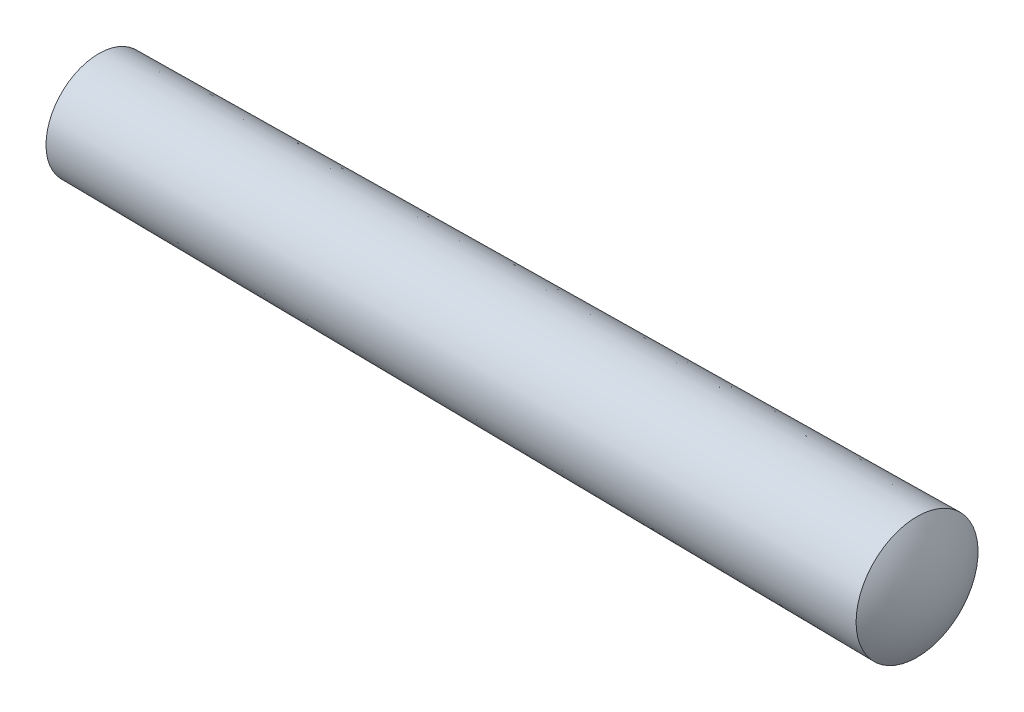
ISO-10303-21;
HEADER;
FILE_DESCRIPTION(('STEP AP214'),'2;1');
FILE_NAME('part.step','',(''),(''),'','','');
FILE_SCHEMA(('AUTOMOTIVE_DESIGN { 1 0 10303 214 1 1 1 1 }'));
ENDSEC;
DATA;
#1=APPLICATION_CONTEXT('core data for automotive mechanical design processes');
#2=APPLICATION_PROTOCOL_DEFINITION('international standard','automotive_design',2000,#1);
#3=PRODUCT_CONTEXT('',#1,'mechanical');
#4=PRODUCT('Part','Part','',(#3));
#5=PRODUCT_RELATED_PRODUCT_CATEGORY('part','',(#4));
#6=PRODUCT_DEFINITION_FORMATION('','',#4);
#7=PRODUCT_DEFINITION_CONTEXT('part definition',#1,'design');
#8=PRODUCT_DEFINITION('design','',#6,#7);
#9=PRODUCT_DEFINITION_SHAPE('','',#8);
#10=(LENGTH_UNIT() NAMED_UNIT(*) SI_UNIT(.MILLI.,.METRE.));
#11=(NAMED_UNIT(*) PLANE_ANGLE_UNIT() SI_UNIT($,.RADIAN.));
#12=(NAMED_UNIT(*) SI_UNIT($,.STERADIAN.) SOLID_ANGLE_UNIT());
#13=UNCERTAINTY_MEASURE_WITH_UNIT(LENGTH_MEASURE(1.E-05),#10,'distance_accuracy_value','');
#14=(GEOMETRIC_REPRESENTATION_CONTEXT(3) GLOBAL_UNCERTAINTY_ASSIGNED_CONTEXT((#13)) GLOBAL_UNIT_ASSIGNED_CONTEXT((#10,
#11,#12)) REPRESENTATION_CONTEXT('',''));
#15=CARTESIAN_POINT('',(0.,0.,0.));
#16=DIRECTION('',(0.,0.,1.));
#17=DIRECTION('',(1.,0.,0.));
#18=AXIS2_PLACEMENT_3D('',#15,#16,#17);
#19=CARTESIAN_POINT('',(34.657975840019,0.,0.));
#20=DIRECTION('',(-1.,0.,0.));
#21=DIRECTION('',(0.,-1.,0.));
#22=AXIS2_PLACEMENT_3D('',#19,#20,#21);
#23=SPHERICAL_SURFACE('',#22,5.);
#24=CARTESIAN_POINT('',(38.74,0.,0.));
#25=DIRECTION('',(-1.,0.,0.));
#26=DIRECTION('',(0.,0.,1.));
#27=AXIS2_PLACEMENT_3D('',#24,#25,#26);
#28=CIRCLE('',#27,2.88739999953784);
#29=CARTESIAN_POINT('',(38.74,0.,2.88739999953784));
#30=VERTEX_POINT('',#29);
#31=EDGE_CURVE('E36',#30,#30,#28,.T.);
#32=ORIENTED_EDGE('',*,*,#31,.F.);
#33=EDGE_LOOP('',(#32));
#34=FACE_BOUND('',#33,.T.);
#35=ADVANCED_FACE('F30',(#34),#23,.T.);
#36=CARTESIAN_POINT('',(4.33012701892219,0.,0.));
#37=DIRECTION('',(-1.,0.,0.));
#38=DIRECTION('',(0.,1.,0.));
#39=AXIS2_PLACEMENT_3D('',#36,#37,#38);
#40=SPHERICAL_SURFACE('',#39,5.);
#41=CARTESIAN_POINT('',(0.,0.,0.));
#42=DIRECTION('',(-1.,0.,0.));
#43=DIRECTION('',(0.,0.,1.));
#44=AXIS2_PLACEMENT_3D('',#41,#42,#43);
#45=CIRCLE('',#44,2.5);
#46=CARTESIAN_POINT('',(0.,0.,2.5));
#47=VERTEX_POINT('',#46);
#48=EDGE_CURVE('E10',#47,#47,#45,.T.);
#49=ORIENTED_EDGE('',*,*,#48,.T.);
#50=EDGE_LOOP('',(#49));
#51=FACE_BOUND('',#50,.T.);
#52=ADVANCED_FACE('F45',(#51),#40,.T.);
#53=CARTESIAN_POINT('',(38.74,0.,0.));
#54=DIRECTION('',(1.,0.,0.));
#55=DIRECTION('',(0.,0.,-1.));
#56=AXIS2_PLACEMENT_3D('',#53,#54,#55);
#57=CONICAL_SURFACE('',#56,2.88739999953784,0.00999966667473666);
#58=ORIENTED_EDGE('',*,*,#48,.F.);
#59=EDGE_LOOP('',(#58));
#60=FACE_BOUND('',#59,.T.);
#61=ORIENTED_EDGE('',*,*,#31,.T.);
#62=EDGE_LOOP('',(#61));
#63=FACE_BOUND('',#62,.T.);
#64=ADVANCED_FACE('F42',(#60,#63),#57,.T.);
#65=CLOSED_SHELL('',(#35,#52,#64));
#66=MANIFOLD_SOLID_BREP('B2',#65);
#67=ADVANCED_BREP_SHAPE_REPRESENTATION('',(#18,#66),#14);
#68=SHAPE_DEFINITION_REPRESENTATION(#9,#67);
ENDSEC;
END-ISO-10303-21;
